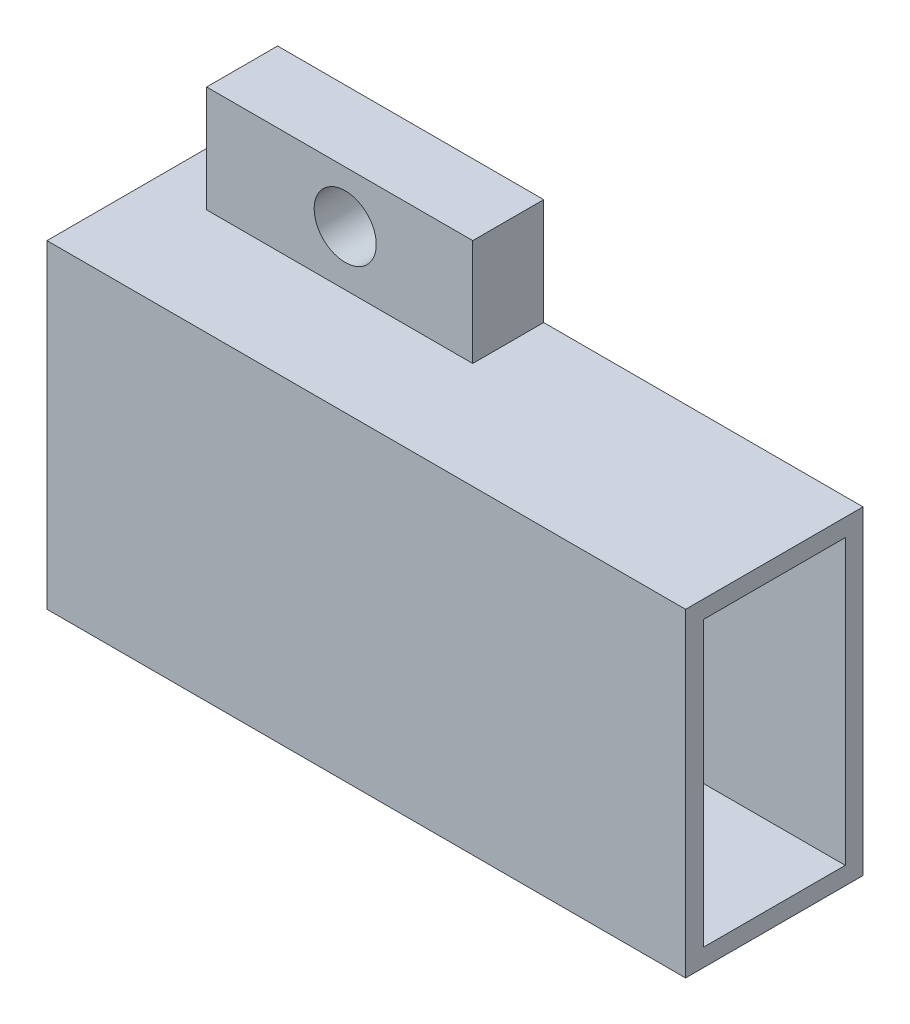
ISO-10303-21;
HEADER;
FILE_DESCRIPTION(('STEP AP214'),'2;1');
FILE_NAME('part.step','',(''),(''),'','','');
FILE_SCHEMA(('AUTOMOTIVE_DESIGN { 1 0 10303 214 1 1 1 1 }'));
ENDSEC;
DATA;
#1=APPLICATION_CONTEXT('core data for automotive mechanical design processes');
#2=APPLICATION_PROTOCOL_DEFINITION('international standard','automotive_design',2000,#1);
#3=PRODUCT_CONTEXT('',#1,'mechanical');
#4=PRODUCT('Part','Part','',(#3));
#5=PRODUCT_RELATED_PRODUCT_CATEGORY('part','',(#4));
#6=PRODUCT_DEFINITION_FORMATION('','',#4);
#7=PRODUCT_DEFINITION_CONTEXT('part definition',#1,'design');
#8=PRODUCT_DEFINITION('design','',#6,#7);
#9=PRODUCT_DEFINITION_SHAPE('','',#8);
#10=(LENGTH_UNIT() NAMED_UNIT(*) SI_UNIT(.MILLI.,.METRE.));
#11=(NAMED_UNIT(*) PLANE_ANGLE_UNIT() SI_UNIT($,.RADIAN.));
#12=(NAMED_UNIT(*) SI_UNIT($,.STERADIAN.) SOLID_ANGLE_UNIT());
#13=UNCERTAINTY_MEASURE_WITH_UNIT(LENGTH_MEASURE(1.E-05),#10,'distance_accuracy_value','');
#14=(GEOMETRIC_REPRESENTATION_CONTEXT(3) GLOBAL_UNCERTAINTY_ASSIGNED_CONTEXT((#13)) GLOBAL_UNIT_ASSIGNED_CONTEXT((#10,
#11,#12)) REPRESENTATION_CONTEXT('',''));
#15=CARTESIAN_POINT('',(0.,0.,0.));
#16=DIRECTION('',(0.,0.,1.));
#17=DIRECTION('',(1.,0.,0.));
#18=AXIS2_PLACEMENT_3D('',#15,#16,#17);
#19=CARTESIAN_POINT('',(-18.,-9.,10.));
#20=DIRECTION('',(0.,1.,0.));
#21=DIRECTION('',(0.,0.,1.));
#22=AXIS2_PLACEMENT_3D('',#19,#20,#21);
#23=PLANE('',#22);
#24=DIRECTION('',(0.,0.,-1.));
#25=VECTOR('',#24,1.);
#26=CARTESIAN_POINT('',(-15.,-8.99999999999999,4.));
#27=LINE('',#26,#25);
#28=CARTESIAN_POINT('',(-15.,-8.99999999999999,4.));
#29=VERTEX_POINT('',#28);
#30=CARTESIAN_POINT('',(-15.,-8.99999999999999,0.));
#31=VERTEX_POINT('',#30);
#32=EDGE_CURVE('E199',#29,#31,#27,.T.);
#33=ORIENTED_EDGE('',*,*,#32,.F.);
#34=DIRECTION('',(1.,0.,0.));
#35=VECTOR('',#34,1.);
#36=CARTESIAN_POINT('',(0.,-9.,4.));
#37=LINE('',#36,#35);
#38=CARTESIAN_POINT('',(0.,-9.,4.));
#39=VERTEX_POINT('',#38);
#40=EDGE_CURVE('E164',#29,#39,#37,.T.);
#41=ORIENTED_EDGE('',*,*,#40,.T.);
#42=DIRECTION('',(0.,0.,-1.));
#43=VECTOR('',#42,1.);
#44=CARTESIAN_POINT('',(0.,-9.,4.));
#45=LINE('',#44,#43);
#46=CARTESIAN_POINT('',(0.,-9.,0.));
#47=VERTEX_POINT('',#46);
#48=EDGE_CURVE('E177',#39,#47,#45,.T.);
#49=ORIENTED_EDGE('',*,*,#48,.T.);
#50=DIRECTION('',(1.,0.,0.));
#51=VECTOR('',#50,1.);
#52=CARTESIAN_POINT('',(-18.,-9.,0.));
#53=LINE('',#52,#51);
#54=CARTESIAN_POINT('',(18.,-9.,0.));
#55=VERTEX_POINT('',#54);
#56=EDGE_CURVE('E316',#47,#55,#53,.T.);
#57=ORIENTED_EDGE('',*,*,#56,.T.);
#58=DIRECTION('',(0.,0.,-1.));
#59=VECTOR('',#58,1.);
#60=CARTESIAN_POINT('',(18.,-9.,10.));
#61=LINE('',#60,#59);
#62=CARTESIAN_POINT('',(18.,-9.,10.));
#63=VERTEX_POINT('',#62);
#64=EDGE_CURVE('E304',#63,#55,#61,.T.);
#65=ORIENTED_EDGE('',*,*,#64,.F.);
#66=DIRECTION('',(1.,0.,0.));
#67=VECTOR('',#66,1.);
#68=CARTESIAN_POINT('',(-18.,-9.,10.));
#69=LINE('',#68,#67);
#70=CARTESIAN_POINT('',(-18.,-9.,10.));
#71=VERTEX_POINT('',#70);
#72=EDGE_CURVE('E301',#71,#63,#69,.T.);
#73=ORIENTED_EDGE('',*,*,#72,.F.);
#74=DIRECTION('',(0.,0.,-1.));
#75=VECTOR('',#74,1.);
#76=CARTESIAN_POINT('',(-18.,-9.,10.));
#77=LINE('',#76,#75);
#78=CARTESIAN_POINT('',(-18.,-9.,0.));
#79=VERTEX_POINT('',#78);
#80=EDGE_CURVE('E323',#71,#79,#77,.T.);
#81=ORIENTED_EDGE('',*,*,#80,.T.);
#82=EDGE_CURVE('E295',#79,#31,#53,.T.);
#83=ORIENTED_EDGE('',*,*,#82,.T.);
#84=EDGE_LOOP('',(#33,#41,#49,#57,#65,#73,#81,#83));
#85=FACE_BOUND('',#84,.T.);
#86=ADVANCED_FACE('F39',(#85),#23,.F.);
#87=CARTESIAN_POINT('',(-18.,9.,10.));
#88=DIRECTION('',(0.,-1.,0.));
#89=DIRECTION('',(0.,0.,-1.));
#90=AXIS2_PLACEMENT_3D('',#87,#88,#89);
#91=PLANE('',#90);
#92=DIRECTION('',(0.,0.,-1.));
#93=VECTOR('',#92,1.);
#94=CARTESIAN_POINT('',(0.,9.,4.));
#95=LINE('',#94,#93);
#96=CARTESIAN_POINT('',(0.,9.,4.));
#97=VERTEX_POINT('',#96);
#98=CARTESIAN_POINT('',(0.,9.,0.));
#99=VERTEX_POINT('',#98);
#100=EDGE_CURVE('E221',#97,#99,#95,.T.);
#101=ORIENTED_EDGE('',*,*,#100,.F.);
#102=DIRECTION('',(-1.,0.,0.));
#103=VECTOR('',#102,1.);
#104=CARTESIAN_POINT('',(0.,9.,4.));
#105=LINE('',#104,#103);
#106=CARTESIAN_POINT('',(-15.,9.,4.));
#107=VERTEX_POINT('',#106);
#108=EDGE_CURVE('E208',#97,#107,#105,.T.);
#109=ORIENTED_EDGE('',*,*,#108,.T.);
#110=DIRECTION('',(0.,0.,-1.));
#111=VECTOR('',#110,1.);
#112=CARTESIAN_POINT('',(-15.,9.,4.));
#113=LINE('',#112,#111);
#114=CARTESIAN_POINT('',(-15.,9.,0.));
#115=VERTEX_POINT('',#114);
#116=EDGE_CURVE('E237',#107,#115,#113,.T.);
#117=ORIENTED_EDGE('',*,*,#116,.T.);
#118=DIRECTION('',(-1.,0.,0.));
#119=VECTOR('',#118,1.);
#120=CARTESIAN_POINT('',(-18.,9.,0.));
#121=LINE('',#120,#119);
#122=CARTESIAN_POINT('',(-18.,9.,0.));
#123=VERTEX_POINT('',#122);
#124=EDGE_CURVE('E308',#115,#123,#121,.T.);
#125=ORIENTED_EDGE('',*,*,#124,.T.);
#126=DIRECTION('',(0.,0.,-1.));
#127=VECTOR('',#126,1.);
#128=CARTESIAN_POINT('',(-18.,9.,10.));
#129=LINE('',#128,#127);
#130=CARTESIAN_POINT('',(-18.,9.,10.));
#131=VERTEX_POINT('',#130);
#132=EDGE_CURVE('E49',#131,#123,#129,.T.);
#133=ORIENTED_EDGE('',*,*,#132,.F.);
#134=DIRECTION('',(-1.,0.,0.));
#135=VECTOR('',#134,1.);
#136=CARTESIAN_POINT('',(-18.,9.,10.));
#137=LINE('',#136,#135);
#138=CARTESIAN_POINT('',(18.,9.,10.));
#139=VERTEX_POINT('',#138);
#140=EDGE_CURVE('E294',#139,#131,#137,.T.);
#141=ORIENTED_EDGE('',*,*,#140,.F.);
#142=DIRECTION('',(0.,0.,-1.));
#143=VECTOR('',#142,1.);
#144=CARTESIAN_POINT('',(18.,9.,10.));
#145=LINE('',#144,#143);
#146=CARTESIAN_POINT('',(18.,9.,0.));
#147=VERTEX_POINT('',#146);
#148=EDGE_CURVE('E11',#139,#147,#145,.T.);
#149=ORIENTED_EDGE('',*,*,#148,.T.);
#150=EDGE_CURVE('E309',#147,#99,#121,.T.);
#151=ORIENTED_EDGE('',*,*,#150,.T.);
#152=EDGE_LOOP('',(#101,#109,#117,#125,#133,#141,#149,#151));
#153=FACE_BOUND('',#152,.T.);
#154=ADVANCED_FACE('F374',(#153),#91,.F.);
#155=CARTESIAN_POINT('',(18.,9.,10.));
#156=DIRECTION('',(-1.,0.,0.));
#157=DIRECTION('',(0.,-1.,0.));
#158=AXIS2_PLACEMENT_3D('',#155,#156,#157);
#159=PLANE('',#158);
#160=DIRECTION('',(0.,1.,0.));
#161=VECTOR('',#160,1.);
#162=CARTESIAN_POINT('',(18.,9.,0.));
#163=LINE('',#162,#161);
#164=EDGE_CURVE('E280',#55,#147,#163,.T.);
#165=ORIENTED_EDGE('',*,*,#164,.T.);
#166=ORIENTED_EDGE('',*,*,#148,.F.);
#167=DIRECTION('',(0.,1.,0.));
#168=VECTOR('',#167,1.);
#169=CARTESIAN_POINT('',(18.,9.,10.));
#170=LINE('',#169,#168);
#171=EDGE_CURVE('E290',#63,#139,#170,.T.);
#172=ORIENTED_EDGE('',*,*,#171,.F.);
#173=ORIENTED_EDGE('',*,*,#64,.T.);
#174=EDGE_LOOP('',(#165,#166,#172,#173));
#175=FACE_BOUND('',#174,.T.);
#176=DIRECTION('',(0.,1.,0.));
#177=VECTOR('',#176,1.);
#178=CARTESIAN_POINT('',(18.,9.,0.999999999999999));
#179=LINE('',#178,#177);
#180=CARTESIAN_POINT('',(18.,-8.,1.));
#181=VERTEX_POINT('',#180);
#182=CARTESIAN_POINT('',(18.,8.,1.));
#183=VERTEX_POINT('',#182);
#184=EDGE_CURVE('E250',#181,#183,#179,.T.);
#185=ORIENTED_EDGE('',*,*,#184,.F.);
#186=DIRECTION('',(0.,0.,-1.));
#187=VECTOR('',#186,1.);
#188=CARTESIAN_POINT('',(18.,-8.,10.));
#189=LINE('',#188,#187);
#190=CARTESIAN_POINT('',(18.,-8.,9.));
#191=VERTEX_POINT('',#190);
#192=EDGE_CURVE('E268',#191,#181,#189,.T.);
#193=ORIENTED_EDGE('',*,*,#192,.F.);
#194=DIRECTION('',(0.,1.,0.));
#195=VECTOR('',#194,1.);
#196=CARTESIAN_POINT('',(18.,9.,9.));
#197=LINE('',#196,#195);
#198=CARTESIAN_POINT('',(18.,8.,9.));
#199=VERTEX_POINT('',#198);
#200=EDGE_CURVE('E261',#191,#199,#197,.T.);
#201=ORIENTED_EDGE('',*,*,#200,.T.);
#202=DIRECTION('',(0.,0.,-1.));
#203=VECTOR('',#202,1.);
#204=CARTESIAN_POINT('',(18.,8.,10.));
#205=LINE('',#204,#203);
#206=EDGE_CURVE('E255',#199,#183,#205,.T.);
#207=ORIENTED_EDGE('',*,*,#206,.T.);
#208=EDGE_LOOP('',(#185,#193,#201,#207));
#209=FACE_BOUND('',#208,.T.);
#210=ADVANCED_FACE('F41',(#175,#209),#159,.F.);
#211=CARTESIAN_POINT('',(-18.,9.,10.));
#212=DIRECTION('',(1.,0.,0.));
#213=DIRECTION('',(0.,1.,0.));
#214=AXIS2_PLACEMENT_3D('',#211,#212,#213);
#215=PLANE('',#214);
#216=CARTESIAN_POINT('',(-18.,0.,4.22183108949531));
#217=DIRECTION('',(-1.,0.,0.));
#218=DIRECTION('',(0.,-1.,0.));
#219=AXIS2_PLACEMENT_3D('',#216,#217,#218);
#220=CIRCLE('',#219,3.);
#221=CARTESIAN_POINT('',(-18.,-3.00000000000001,4.22183108949531));
#222=VERTEX_POINT('',#221);
#223=EDGE_CURVE('E233',#222,#222,#220,.T.);
#224=ORIENTED_EDGE('',*,*,#223,.F.);
#225=EDGE_LOOP('',(#224));
#226=FACE_BOUND('',#225,.T.);
#227=DIRECTION('',(0.,-1.,0.));
#228=VECTOR('',#227,1.);
#229=CARTESIAN_POINT('',(-18.,9.,0.));
#230=LINE('',#229,#228);
#231=EDGE_CURVE('E313',#123,#79,#230,.T.);
#232=ORIENTED_EDGE('',*,*,#231,.T.);
#233=ORIENTED_EDGE('',*,*,#80,.F.);
#234=DIRECTION('',(0.,-1.,0.));
#235=VECTOR('',#234,1.);
#236=CARTESIAN_POINT('',(-18.,9.,10.));
#237=LINE('',#236,#235);
#238=EDGE_CURVE('E298',#131,#71,#237,.T.);
#239=ORIENTED_EDGE('',*,*,#238,.F.);
#240=ORIENTED_EDGE('',*,*,#132,.T.);
#241=EDGE_LOOP('',(#232,#233,#239,#240));
#242=FACE_BOUND('',#241,.T.);
#243=ADVANCED_FACE('F378',(#226,#242),#215,.F.);
#244=CARTESIAN_POINT('',(0.,0.,10.));
#245=DIRECTION('',(0.,0.,1.));
#246=DIRECTION('',(1.,0.,0.));
#247=AXIS2_PLACEMENT_3D('',#244,#245,#246);
#248=PLANE('',#247);
#249=ORIENTED_EDGE('',*,*,#171,.T.);
#250=ORIENTED_EDGE('',*,*,#140,.T.);
#251=ORIENTED_EDGE('',*,*,#238,.T.);
#252=ORIENTED_EDGE('',*,*,#72,.T.);
#253=EDGE_LOOP('',(#249,#250,#251,#252));
#254=FACE_BOUND('',#253,.T.);
#255=ADVANCED_FACE('F355',(#254),#248,.T.);
#256=CARTESIAN_POINT('',(0.,0.,0.));
#257=DIRECTION('',(0.,0.,1.));
#258=DIRECTION('',(1.,0.,0.));
#259=AXIS2_PLACEMENT_3D('',#256,#257,#258);
#260=PLANE('',#259);
#261=CARTESIAN_POINT('',(-7.18914476759629,12.0891247409534,0.));
#262=DIRECTION('',(0.,0.,-1.));
#263=DIRECTION('',(-1.,0.,0.));
#264=AXIS2_PLACEMENT_3D('',#261,#262,#263);
#265=CIRCLE('',#264,1.75);
#266=CARTESIAN_POINT('',(-8.93914476759629,12.0891247409534,0.));
#267=VERTEX_POINT('',#266);
#268=EDGE_CURVE('E335',#267,#267,#265,.T.);
#269=ORIENTED_EDGE('',*,*,#268,.F.);
#270=EDGE_LOOP('',(#269));
#271=FACE_BOUND('',#270,.T.);
#272=CARTESIAN_POINT('',(-7.18914476759629,-12.0458612645485,0.));
#273=DIRECTION('',(0.,0.,-1.));
#274=DIRECTION('',(-1.,0.,0.));
#275=AXIS2_PLACEMENT_3D('',#272,#273,#274);
#276=CIRCLE('',#275,1.75);
#277=CARTESIAN_POINT('',(-8.93914476759629,-12.0458612645485,0.));
#278=VERTEX_POINT('',#277);
#279=EDGE_CURVE('E185',#278,#278,#276,.T.);
#280=ORIENTED_EDGE('',*,*,#279,.F.);
#281=EDGE_LOOP('',(#280));
#282=FACE_BOUND('',#281,.T.);
#283=ORIENTED_EDGE('',*,*,#164,.F.);
#284=ORIENTED_EDGE('',*,*,#56,.F.);
#285=DIRECTION('',(0.,-1.,0.));
#286=VECTOR('',#285,1.);
#287=CARTESIAN_POINT('',(0.,-9.,0.));
#288=LINE('',#287,#286);
#289=CARTESIAN_POINT('',(0.,-15.,0.));
#290=VERTEX_POINT('',#289);
#291=EDGE_CURVE('E57',#47,#290,#288,.T.);
#292=ORIENTED_EDGE('',*,*,#291,.T.);
#293=DIRECTION('',(-1.,0.,0.));
#294=VECTOR('',#293,1.);
#295=CARTESIAN_POINT('',(0.,-15.,0.));
#296=LINE('',#295,#294);
#297=CARTESIAN_POINT('',(-15.,-15.,0.));
#298=VERTEX_POINT('',#297);
#299=EDGE_CURVE('E160',#290,#298,#296,.T.);
#300=ORIENTED_EDGE('',*,*,#299,.T.);
#301=DIRECTION('',(0.,1.,0.));
#302=VECTOR('',#301,1.);
#303=CARTESIAN_POINT('',(-15.,-8.99999999999999,0.));
#304=LINE('',#303,#302);
#305=EDGE_CURVE('E179',#298,#31,#304,.T.);
#306=ORIENTED_EDGE('',*,*,#305,.T.);
#307=ORIENTED_EDGE('',*,*,#82,.F.);
#308=ORIENTED_EDGE('',*,*,#231,.F.);
#309=ORIENTED_EDGE('',*,*,#124,.F.);
#310=DIRECTION('',(0.,1.,0.));
#311=VECTOR('',#310,1.);
#312=CARTESIAN_POINT('',(-15.,9.,0.));
#313=LINE('',#312,#311);
#314=CARTESIAN_POINT('',(-15.,15.,0.));
#315=VERTEX_POINT('',#314);
#316=EDGE_CURVE('E65',#115,#315,#313,.T.);
#317=ORIENTED_EDGE('',*,*,#316,.T.);
#318=DIRECTION('',(1.,0.,0.));
#319=VECTOR('',#318,1.);
#320=CARTESIAN_POINT('',(0.,15.,0.));
#321=LINE('',#320,#319);
#322=CARTESIAN_POINT('',(0.,15.,0.));
#323=VERTEX_POINT('',#322);
#324=EDGE_CURVE('E209',#315,#323,#321,.T.);
#325=ORIENTED_EDGE('',*,*,#324,.T.);
#326=DIRECTION('',(0.,-1.,0.));
#327=VECTOR('',#326,1.);
#328=CARTESIAN_POINT('',(0.,9.,0.));
#329=LINE('',#328,#327);
#330=EDGE_CURVE('E198',#323,#99,#329,.T.);
#331=ORIENTED_EDGE('',*,*,#330,.T.);
#332=ORIENTED_EDGE('',*,*,#150,.F.);
#333=EDGE_LOOP('',(#283,#284,#292,#300,#306,#307,#308,#309,#317,#325,#331,#332));
#334=FACE_BOUND('',#333,.T.);
#335=ADVANCED_FACE('F351',(#271,#282,#334),#260,.F.);
#336=CARTESIAN_POINT('',(-18.,8.,10.));
#337=DIRECTION('',(0.,-1.,0.));
#338=DIRECTION('',(0.,0.,-1.));
#339=AXIS2_PLACEMENT_3D('',#336,#337,#338);
#340=PLANE('',#339);
#341=DIRECTION('',(-1.,0.,0.));
#342=VECTOR('',#341,1.);
#343=CARTESIAN_POINT('',(-18.,8.,0.999999999999999));
#344=LINE('',#343,#342);
#345=CARTESIAN_POINT('',(-17.,8.,1.));
#346=VERTEX_POINT('',#345);
#347=EDGE_CURVE('E246',#183,#346,#344,.T.);
#348=ORIENTED_EDGE('',*,*,#347,.F.);
#349=ORIENTED_EDGE('',*,*,#206,.F.);
#350=DIRECTION('',(-1.,0.,0.));
#351=VECTOR('',#350,1.);
#352=CARTESIAN_POINT('',(-18.,8.,9.));
#353=LINE('',#352,#351);
#354=CARTESIAN_POINT('',(-17.,8.,9.));
#355=VERTEX_POINT('',#354);
#356=EDGE_CURVE('E257',#199,#355,#353,.T.);
#357=ORIENTED_EDGE('',*,*,#356,.T.);
#358=DIRECTION('',(0.,0.,-1.));
#359=VECTOR('',#358,1.);
#360=CARTESIAN_POINT('',(-17.,8.,10.));
#361=LINE('',#360,#359);
#362=EDGE_CURVE('E251',#355,#346,#361,.T.);
#363=ORIENTED_EDGE('',*,*,#362,.T.);
#364=EDGE_LOOP('',(#348,#349,#357,#363));
#365=FACE_BOUND('',#364,.T.);
#366=ADVANCED_FACE('F354',(#365),#340,.T.);
#367=CARTESIAN_POINT('',(-17.,9.,10.));
#368=DIRECTION('',(1.,0.,0.));
#369=DIRECTION('',(0.,1.,0.));
#370=AXIS2_PLACEMENT_3D('',#367,#368,#369);
#371=PLANE('',#370);
#372=CARTESIAN_POINT('',(-17.,0.,4.22183108949531));
#373=DIRECTION('',(1.,0.,0.));
#374=DIRECTION('',(0.,1.,0.));
#375=AXIS2_PLACEMENT_3D('',#372,#373,#374);
#376=CIRCLE('',#375,3.);
#377=CARTESIAN_POINT('',(-17.,3.,4.22183108949531));
#378=VERTEX_POINT('',#377);
#379=EDGE_CURVE('E245',#378,#378,#376,.T.);
#380=ORIENTED_EDGE('',*,*,#379,.F.);
#381=EDGE_LOOP('',(#380));
#382=FACE_BOUND('',#381,.T.);
#383=DIRECTION('',(0.,-1.,0.));
#384=VECTOR('',#383,1.);
#385=CARTESIAN_POINT('',(-17.,9.,0.999999999999999));
#386=LINE('',#385,#384);
#387=CARTESIAN_POINT('',(-17.,-8.,1.));
#388=VERTEX_POINT('',#387);
#389=EDGE_CURVE('E249',#346,#388,#386,.T.);
#390=ORIENTED_EDGE('',*,*,#389,.F.);
#391=ORIENTED_EDGE('',*,*,#362,.F.);
#392=DIRECTION('',(0.,-1.,0.));
#393=VECTOR('',#392,1.);
#394=CARTESIAN_POINT('',(-17.,9.,9.));
#395=LINE('',#394,#393);
#396=CARTESIAN_POINT('',(-17.,-8.,9.));
#397=VERTEX_POINT('',#396);
#398=EDGE_CURVE('E260',#355,#397,#395,.T.);
#399=ORIENTED_EDGE('',*,*,#398,.T.);
#400=DIRECTION('',(0.,0.,-1.));
#401=VECTOR('',#400,1.);
#402=CARTESIAN_POINT('',(-17.,-8.,10.));
#403=LINE('',#402,#401);
#404=EDGE_CURVE('E256',#397,#388,#403,.T.);
#405=ORIENTED_EDGE('',*,*,#404,.T.);
#406=EDGE_LOOP('',(#390,#391,#399,#405));
#407=FACE_BOUND('',#406,.T.);
#408=ADVANCED_FACE('F431',(#382,#407),#371,.T.);
#409=CARTESIAN_POINT('',(-18.,-8.,10.));
#410=DIRECTION('',(0.,1.,0.));
#411=DIRECTION('',(0.,0.,1.));
#412=AXIS2_PLACEMENT_3D('',#409,#410,#411);
#413=PLANE('',#412);
#414=DIRECTION('',(1.,0.,0.));
#415=VECTOR('',#414,1.);
#416=CARTESIAN_POINT('',(-18.,-8.,0.999999999999999));
#417=LINE('',#416,#415);
#418=EDGE_CURVE('E264',#388,#181,#417,.T.);
#419=ORIENTED_EDGE('',*,*,#418,.F.);
#420=ORIENTED_EDGE('',*,*,#404,.F.);
#421=DIRECTION('',(1.,0.,0.));
#422=VECTOR('',#421,1.);
#423=CARTESIAN_POINT('',(-18.,-8.,9.));
#424=LINE('',#423,#422);
#425=EDGE_CURVE('E271',#397,#191,#424,.T.);
#426=ORIENTED_EDGE('',*,*,#425,.T.);
#427=ORIENTED_EDGE('',*,*,#192,.T.);
#428=EDGE_LOOP('',(#419,#420,#426,#427));
#429=FACE_BOUND('',#428,.T.);
#430=ADVANCED_FACE('F435',(#429),#413,.T.);
#431=CARTESIAN_POINT('',(0.,0.,9.));
#432=DIRECTION('',(0.,0.,1.));
#433=DIRECTION('',(1.,0.,0.));
#434=AXIS2_PLACEMENT_3D('',#431,#432,#433);
#435=PLANE('',#434);
#436=ORIENTED_EDGE('',*,*,#200,.F.);
#437=ORIENTED_EDGE('',*,*,#425,.F.);
#438=ORIENTED_EDGE('',*,*,#398,.F.);
#439=ORIENTED_EDGE('',*,*,#356,.F.);
#440=EDGE_LOOP('',(#436,#437,#438,#439));
#441=FACE_BOUND('',#440,.T.);
#442=ADVANCED_FACE('F424',(#441),#435,.F.);
#443=CARTESIAN_POINT('',(0.,0.,1.));
#444=DIRECTION('',(0.,0.,1.));
#445=DIRECTION('',(1.,0.,0.));
#446=AXIS2_PLACEMENT_3D('',#443,#444,#445);
#447=PLANE('',#446);
#448=ORIENTED_EDGE('',*,*,#184,.T.);
#449=ORIENTED_EDGE('',*,*,#347,.T.);
#450=ORIENTED_EDGE('',*,*,#389,.T.);
#451=ORIENTED_EDGE('',*,*,#418,.T.);
#452=EDGE_LOOP('',(#448,#449,#450,#451));
#453=FACE_BOUND('',#452,.T.);
#454=ADVANCED_FACE('F414',(#453),#447,.T.);
#455=CARTESIAN_POINT('',(-10.,0.,4.22183108949531));
#456=DIRECTION('',(-1.,0.,0.));
#457=DIRECTION('',(0.,-1.,0.));
#458=AXIS2_PLACEMENT_3D('',#455,#456,#457);
#459=CYLINDRICAL_SURFACE('',#458,3.);
#460=ORIENTED_EDGE('',*,*,#379,.T.);
#461=EDGE_LOOP('',(#460));
#462=FACE_BOUND('',#461,.T.);
#463=ORIENTED_EDGE('',*,*,#223,.T.);
#464=EDGE_LOOP('',(#463));
#465=FACE_BOUND('',#464,.T.);
#466=ADVANCED_FACE('F411',(#462,#465),#459,.F.);
#467=CARTESIAN_POINT('',(0.,9.,4.));
#468=DIRECTION('',(1.,0.,0.));
#469=DIRECTION('',(0.,1.,0.));
#470=AXIS2_PLACEMENT_3D('',#467,#468,#469);
#471=PLANE('',#470);
#472=ORIENTED_EDGE('',*,*,#330,.F.);
#473=DIRECTION('',(0.,0.,-1.));
#474=VECTOR('',#473,1.);
#475=CARTESIAN_POINT('',(0.,15.,4.));
#476=LINE('',#475,#474);
#477=CARTESIAN_POINT('',(0.,15.,4.));
#478=VERTEX_POINT('',#477);
#479=EDGE_CURVE('E230',#478,#323,#476,.T.);
#480=ORIENTED_EDGE('',*,*,#479,.F.);
#481=DIRECTION('',(0.,-1.,0.));
#482=VECTOR('',#481,1.);
#483=CARTESIAN_POINT('',(0.,9.,4.));
#484=LINE('',#483,#482);
#485=EDGE_CURVE('E204',#478,#97,#484,.T.);
#486=ORIENTED_EDGE('',*,*,#485,.T.);
#487=ORIENTED_EDGE('',*,*,#100,.T.);
#488=EDGE_LOOP('',(#472,#480,#486,#487));
#489=FACE_BOUND('',#488,.T.);
#490=ADVANCED_FACE('F413',(#489),#471,.T.);
#491=CARTESIAN_POINT('',(0.,15.,4.));
#492=DIRECTION('',(0.,1.,0.));
#493=DIRECTION('',(0.,0.,1.));
#494=AXIS2_PLACEMENT_3D('',#491,#492,#493);
#495=PLANE('',#494);
#496=ORIENTED_EDGE('',*,*,#324,.F.);
#497=DIRECTION('',(0.,0.,-1.));
#498=VECTOR('',#497,1.);
#499=CARTESIAN_POINT('',(-15.,15.,4.));
#500=LINE('',#499,#498);
#501=CARTESIAN_POINT('',(-15.,15.,4.));
#502=VERTEX_POINT('',#501);
#503=EDGE_CURVE('E234',#502,#315,#500,.T.);
#504=ORIENTED_EDGE('',*,*,#503,.F.);
#505=DIRECTION('',(1.,0.,0.));
#506=VECTOR('',#505,1.);
#507=CARTESIAN_POINT('',(0.,15.,4.));
#508=LINE('',#507,#506);
#509=EDGE_CURVE('E217',#502,#478,#508,.T.);
#510=ORIENTED_EDGE('',*,*,#509,.T.);
#511=ORIENTED_EDGE('',*,*,#479,.T.);
#512=EDGE_LOOP('',(#496,#504,#510,#511));
#513=FACE_BOUND('',#512,.T.);
#514=ADVANCED_FACE('F421',(#513),#495,.T.);
#515=CARTESIAN_POINT('',(-15.,9.,4.));
#516=DIRECTION('',(-1.,0.,0.));
#517=DIRECTION('',(0.,0.,1.));
#518=AXIS2_PLACEMENT_3D('',#515,#516,#517);
#519=PLANE('',#518);
#520=ORIENTED_EDGE('',*,*,#316,.F.);
#521=ORIENTED_EDGE('',*,*,#116,.F.);
#522=DIRECTION('',(0.,1.,0.));
#523=VECTOR('',#522,1.);
#524=CARTESIAN_POINT('',(-15.,9.,4.));
#525=LINE('',#524,#523);
#526=EDGE_CURVE('E213',#107,#502,#525,.T.);
#527=ORIENTED_EDGE('',*,*,#526,.T.);
#528=ORIENTED_EDGE('',*,*,#503,.T.);
#529=EDGE_LOOP('',(#520,#521,#527,#528));
#530=FACE_BOUND('',#529,.T.);
#531=ADVANCED_FACE('F515',(#530),#519,.T.);
#532=CARTESIAN_POINT('',(0.,0.,4.));
#533=DIRECTION('',(0.,0.,1.));
#534=DIRECTION('',(1.,0.,0.));
#535=AXIS2_PLACEMENT_3D('',#532,#533,#534);
#536=PLANE('',#535);
#537=CARTESIAN_POINT('',(-7.18914476759629,12.0891247409534,4.));
#538=DIRECTION('',(0.,0.,1.));
#539=DIRECTION('',(1.,0.,0.));
#540=AXIS2_PLACEMENT_3D('',#537,#538,#539);
#541=CIRCLE('',#540,1.75);
#542=CARTESIAN_POINT('',(-5.43914476759629,12.0891247409534,4.));
#543=VERTEX_POINT('',#542);
#544=EDGE_CURVE('E43',#543,#543,#541,.T.);
#545=ORIENTED_EDGE('',*,*,#544,.F.);
#546=EDGE_LOOP('',(#545));
#547=FACE_BOUND('',#546,.T.);
#548=ORIENTED_EDGE('',*,*,#485,.F.);
#549=ORIENTED_EDGE('',*,*,#509,.F.);
#550=ORIENTED_EDGE('',*,*,#526,.F.);
#551=ORIENTED_EDGE('',*,*,#108,.F.);
#552=EDGE_LOOP('',(#548,#549,#550,#551));
#553=FACE_BOUND('',#552,.T.);
#554=ADVANCED_FACE('F391',(#547,#553),#536,.T.);
#555=CARTESIAN_POINT('',(0.,-9.,4.));
#556=DIRECTION('',(1.,0.,0.));
#557=DIRECTION('',(0.,1.,0.));
#558=AXIS2_PLACEMENT_3D('',#555,#556,#557);
#559=PLANE('',#558);
#560=ORIENTED_EDGE('',*,*,#291,.F.);
#561=ORIENTED_EDGE('',*,*,#48,.F.);
#562=DIRECTION('',(0.,-1.,0.));
#563=VECTOR('',#562,1.);
#564=CARTESIAN_POINT('',(0.,-9.,4.));
#565=LINE('',#564,#563);
#566=CARTESIAN_POINT('',(0.,-15.,4.));
#567=VERTEX_POINT('',#566);
#568=EDGE_CURVE('E171',#39,#567,#565,.T.);
#569=ORIENTED_EDGE('',*,*,#568,.T.);
#570=DIRECTION('',(0.,0.,-1.));
#571=VECTOR('',#570,1.);
#572=CARTESIAN_POINT('',(0.,-15.,4.));
#573=LINE('',#572,#571);
#574=EDGE_CURVE('E155',#567,#290,#573,.T.);
#575=ORIENTED_EDGE('',*,*,#574,.T.);
#576=EDGE_LOOP('',(#560,#561,#569,#575));
#577=FACE_BOUND('',#576,.T.);
#578=ADVANCED_FACE('F176',(#577),#559,.T.);
#579=CARTESIAN_POINT('',(-15.,-8.99999999999999,4.));
#580=DIRECTION('',(-1.,0.,0.));
#581=DIRECTION('',(0.,0.,1.));
#582=AXIS2_PLACEMENT_3D('',#579,#580,#581);
#583=PLANE('',#582);
#584=ORIENTED_EDGE('',*,*,#305,.F.);
#585=DIRECTION('',(0.,0.,-1.));
#586=VECTOR('',#585,1.);
#587=CARTESIAN_POINT('',(-15.,-15.,4.));
#588=LINE('',#587,#586);
#589=CARTESIAN_POINT('',(-15.,-15.,4.));
#590=VERTEX_POINT('',#589);
#591=EDGE_CURVE('E163',#590,#298,#588,.T.);
#592=ORIENTED_EDGE('',*,*,#591,.F.);
#593=DIRECTION('',(0.,1.,0.));
#594=VECTOR('',#593,1.);
#595=CARTESIAN_POINT('',(-15.,-8.99999999999999,4.));
#596=LINE('',#595,#594);
#597=EDGE_CURVE('E173',#590,#29,#596,.T.);
#598=ORIENTED_EDGE('',*,*,#597,.T.);
#599=ORIENTED_EDGE('',*,*,#32,.T.);
#600=EDGE_LOOP('',(#584,#592,#598,#599));
#601=FACE_BOUND('',#600,.T.);
#602=ADVANCED_FACE('F383',(#601),#583,.T.);
#603=CARTESIAN_POINT('',(0.,-15.,4.));
#604=DIRECTION('',(0.,-1.,0.));
#605=DIRECTION('',(0.,0.,-1.));
#606=AXIS2_PLACEMENT_3D('',#603,#604,#605);
#607=PLANE('',#606);
#608=ORIENTED_EDGE('',*,*,#299,.F.);
#609=ORIENTED_EDGE('',*,*,#574,.F.);
#610=DIRECTION('',(-1.,0.,0.));
#611=VECTOR('',#610,1.);
#612=CARTESIAN_POINT('',(0.,-15.,4.));
#613=LINE('',#612,#611);
#614=EDGE_CURVE('E158',#567,#590,#613,.T.);
#615=ORIENTED_EDGE('',*,*,#614,.T.);
#616=ORIENTED_EDGE('',*,*,#591,.T.);
#617=EDGE_LOOP('',(#608,#609,#615,#616));
#618=FACE_BOUND('',#617,.T.);
#619=ADVANCED_FACE('F157',(#618),#607,.T.);
#620=CARTESIAN_POINT('',(0.,0.,4.));
#621=DIRECTION('',(0.,0.,-1.));
#622=DIRECTION('',(-1.,0.,0.));
#623=AXIS2_PLACEMENT_3D('',#620,#621,#622);
#624=PLANE('',#623);
#625=CARTESIAN_POINT('',(-7.18914476759629,-12.0458612645485,4.));
#626=DIRECTION('',(0.,0.,-1.));
#627=DIRECTION('',(-1.,0.,0.));
#628=AXIS2_PLACEMENT_3D('',#625,#626,#627);
#629=CIRCLE('',#628,1.75);
#630=CARTESIAN_POINT('',(-8.93914476759629,-12.0458612645485,4.));
#631=VERTEX_POINT('',#630);
#632=EDGE_CURVE('E332',#631,#631,#629,.T.);
#633=ORIENTED_EDGE('',*,*,#632,.T.);
#634=EDGE_LOOP('',(#633));
#635=FACE_BOUND('',#634,.T.);
#636=ORIENTED_EDGE('',*,*,#568,.F.);
#637=ORIENTED_EDGE('',*,*,#40,.F.);
#638=ORIENTED_EDGE('',*,*,#597,.F.);
#639=ORIENTED_EDGE('',*,*,#614,.F.);
#640=EDGE_LOOP('',(#636,#637,#638,#639));
#641=FACE_BOUND('',#640,.T.);
#642=ADVANCED_FACE('F169',(#635,#641),#624,.F.);
#643=CARTESIAN_POINT('',(-7.18914476759629,-12.0458612645485,12.));
#644=DIRECTION('',(0.,0.,-1.));
#645=DIRECTION('',(-1.,0.,0.));
#646=AXIS2_PLACEMENT_3D('',#643,#644,#645);
#647=CYLINDRICAL_SURFACE('',#646,1.75);
#648=ORIENTED_EDGE('',*,*,#279,.T.);
#649=EDGE_LOOP('',(#648));
#650=FACE_BOUND('',#649,.T.);
#651=ORIENTED_EDGE('',*,*,#632,.F.);
#652=EDGE_LOOP('',(#651));
#653=FACE_BOUND('',#652,.T.);
#654=ADVANCED_FACE('F348',(#650,#653),#647,.F.);
#655=CARTESIAN_POINT('',(-7.18914476759629,12.0891247409534,12.));
#656=DIRECTION('',(0.,0.,-1.));
#657=DIRECTION('',(-1.,0.,0.));
#658=AXIS2_PLACEMENT_3D('',#655,#656,#657);
#659=CYLINDRICAL_SURFACE('',#658,1.75);
#660=ORIENTED_EDGE('',*,*,#544,.T.);
#661=EDGE_LOOP('',(#660));
#662=FACE_BOUND('',#661,.T.);
#663=ORIENTED_EDGE('',*,*,#268,.T.);
#664=EDGE_LOOP('',(#663));
#665=FACE_BOUND('',#664,.T.);
#666=ADVANCED_FACE('F556',(#662,#665),#659,.F.);
#667=CLOSED_SHELL('',(#86,#154,#210,#243,#255,#335,#366,#408,#430,#442,#454,#466,#490,#514,#531,
#554,#578,#602,#619,#642,#654,#666));
#668=MANIFOLD_SOLID_BREP('B2',#667);
#669=ADVANCED_BREP_SHAPE_REPRESENTATION('',(#18,#668),#14);
#670=SHAPE_DEFINITION_REPRESENTATION(#9,#669);
ENDSEC;
END-ISO-10303-21;
